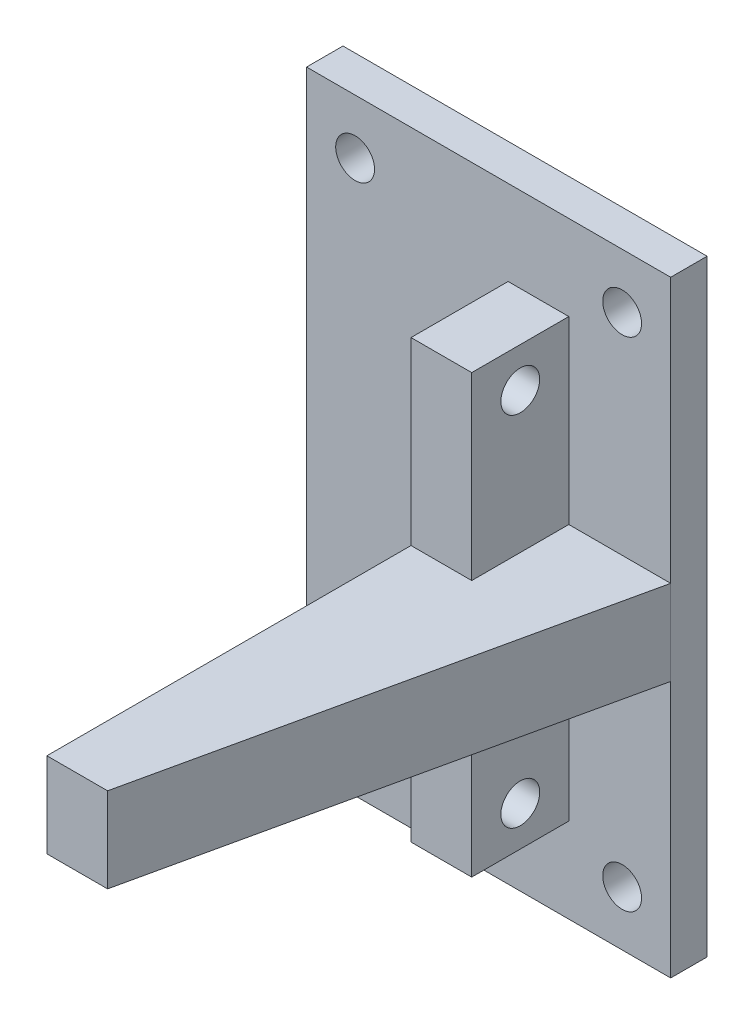
ISO-10303-21;
HEADER;
FILE_DESCRIPTION(('STEP AP214'),'2;1');
FILE_NAME('part.step','',(''),(''),'','','');
FILE_SCHEMA(('AUTOMOTIVE_DESIGN { 1 0 10303 214 1 1 1 1 }'));
ENDSEC;
DATA;
#1=APPLICATION_CONTEXT('core data for automotive mechanical design processes');
#2=APPLICATION_PROTOCOL_DEFINITION('international standard','automotive_design',2000,#1);
#3=PRODUCT_CONTEXT('',#1,'mechanical');
#4=PRODUCT('Part','Part','',(#3));
#5=PRODUCT_RELATED_PRODUCT_CATEGORY('part','',(#4));
#6=PRODUCT_DEFINITION_FORMATION('','',#4);
#7=PRODUCT_DEFINITION_CONTEXT('part definition',#1,'design');
#8=PRODUCT_DEFINITION('design','',#6,#7);
#9=PRODUCT_DEFINITION_SHAPE('','',#8);
#10=(LENGTH_UNIT() NAMED_UNIT(*) SI_UNIT(.MILLI.,.METRE.));
#11=(NAMED_UNIT(*) PLANE_ANGLE_UNIT() SI_UNIT($,.RADIAN.));
#12=(NAMED_UNIT(*) SI_UNIT($,.STERADIAN.) SOLID_ANGLE_UNIT());
#13=UNCERTAINTY_MEASURE_WITH_UNIT(LENGTH_MEASURE(1.E-05),#10,'distance_accuracy_value','');
#14=(GEOMETRIC_REPRESENTATION_CONTEXT(3) GLOBAL_UNCERTAINTY_ASSIGNED_CONTEXT((#13)) GLOBAL_UNIT_ASSIGNED_CONTEXT((#10,
#11,#12)) REPRESENTATION_CONTEXT('',''));
#15=CARTESIAN_POINT('',(0.,0.,0.));
#16=DIRECTION('',(0.,0.,1.));
#17=DIRECTION('',(1.,0.,0.));
#18=AXIS2_PLACEMENT_3D('',#15,#16,#17);
#19=CARTESIAN_POINT('',(-18.3942195591141,3.00000000000001,11.));
#20=DIRECTION('',(-1.,0.,0.));
#21=DIRECTION('',(0.,-1.,0.));
#22=AXIS2_PLACEMENT_3D('',#19,#20,#21);
#23=PLANE('',#22);
#24=CARTESIAN_POINT('',(-18.3942195591141,-29.732,6.99999999999999));
#25=DIRECTION('',(1.,0.,0.));
#26=DIRECTION('',(0.,1.,0.));
#27=AXIS2_PLACEMENT_3D('',#24,#25,#26);
#28=CIRCLE('',#27,1.6);
#29=CARTESIAN_POINT('',(-18.3942195591141,-28.132,6.99999999999999));
#30=VERTEX_POINT('',#29);
#31=EDGE_CURVE('E176',#30,#30,#28,.T.);
#32=ORIENTED_EDGE('',*,*,#31,.F.);
#33=EDGE_LOOP('',(#32));
#34=FACE_BOUND('',#33,.T.);
#35=DIRECTION('',(0.,0.,-1.));
#36=VECTOR('',#35,1.);
#37=CARTESIAN_POINT('',(-18.3942195591141,-18.8399802623942,11.));
#38=LINE('',#37,#36);
#39=CARTESIAN_POINT('',(-18.3942195591141,-18.8399802623942,11.));
#40=VERTEX_POINT('',#39);
#41=CARTESIAN_POINT('',(-18.3942195591141,-18.8399802623942,3.));
#42=VERTEX_POINT('',#41);
#43=EDGE_CURVE('E343',#40,#42,#38,.T.);
#44=ORIENTED_EDGE('',*,*,#43,.F.);
#45=DIRECTION('',(0.,1.,0.));
#46=VECTOR('',#45,1.);
#47=CARTESIAN_POINT('',(-18.3942195591141,3.00000000000001,11.));
#48=LINE('',#47,#46);
#49=CARTESIAN_POINT('',(-18.3942195591141,-33.,11.));
#50=VERTEX_POINT('',#49);
#51=EDGE_CURVE('E194',#50,#40,#48,.T.);
#52=ORIENTED_EDGE('',*,*,#51,.F.);
#53=DIRECTION('',(0.,0.,-1.));
#54=VECTOR('',#53,1.);
#55=CARTESIAN_POINT('',(-18.3942195591141,-33.,11.));
#56=LINE('',#55,#54);
#57=CARTESIAN_POINT('',(-18.3942195591141,-33.,3.));
#58=VERTEX_POINT('',#57);
#59=EDGE_CURVE('E215',#50,#58,#56,.T.);
#60=ORIENTED_EDGE('',*,*,#59,.T.);
#61=DIRECTION('',(0.,1.,0.));
#62=VECTOR('',#61,1.);
#63=CARTESIAN_POINT('',(-18.3942195591141,3.00000000000001,3.));
#64=LINE('',#63,#62);
#65=EDGE_CURVE('E204',#58,#42,#64,.T.);
#66=ORIENTED_EDGE('',*,*,#65,.T.);
#67=EDGE_LOOP('',(#44,#52,#60,#66));
#68=FACE_BOUND('',#67,.T.);
#69=ADVANCED_FACE('F35',(#34,#68),#23,.F.);
#70=CARTESIAN_POINT('',(0.,0.,11.));
#71=DIRECTION('',(0.,0.,-1.));
#72=DIRECTION('',(-1.,0.,0.));
#73=AXIS2_PLACEMENT_3D('',#70,#71,#72);
#74=PLANE('',#73);
#75=DIRECTION('',(-1.,0.,0.));
#76=VECTOR('',#75,1.);
#77=CARTESIAN_POINT('',(-18.3942195591141,-11.8399802623942,11.));
#78=LINE('',#77,#76);
#79=CARTESIAN_POINT('',(-18.3942195591141,-11.8399802623942,11.));
#80=VERTEX_POINT('',#79);
#81=CARTESIAN_POINT('',(-23.3942195591141,-11.8399802623942,11.));
#82=VERTEX_POINT('',#81);
#83=EDGE_CURVE('E163',#80,#82,#78,.T.);
#84=ORIENTED_EDGE('',*,*,#83,.F.);
#85=CARTESIAN_POINT('',(-18.3942195591141,3.00000000000001,11.));
#86=VERTEX_POINT('',#85);
#87=EDGE_CURVE('E193',#80,#86,#48,.T.);
#88=ORIENTED_EDGE('',*,*,#87,.T.);
#89=DIRECTION('',(-1.,0.,0.));
#90=VECTOR('',#89,1.);
#91=CARTESIAN_POINT('',(-18.3942195591141,3.00000000000001,11.));
#92=LINE('',#91,#90);
#93=CARTESIAN_POINT('',(-23.3942195591141,3.00000000000001,11.));
#94=VERTEX_POINT('',#93);
#95=EDGE_CURVE('E196',#86,#94,#92,.T.);
#96=ORIENTED_EDGE('',*,*,#95,.T.);
#97=DIRECTION('',(0.,-1.,0.));
#98=VECTOR('',#97,1.);
#99=CARTESIAN_POINT('',(-23.3942195591141,3.00000000000001,11.));
#100=LINE('',#99,#98);
#101=EDGE_CURVE('E58',#94,#82,#100,.T.);
#102=ORIENTED_EDGE('',*,*,#101,.T.);
#103=EDGE_LOOP('',(#84,#88,#96,#102));
#104=FACE_BOUND('',#103,.T.);
#105=ADVANCED_FACE('F303',(#104),#74,.F.);
#106=DIRECTION('',(1.,0.,0.));
#107=VECTOR('',#106,1.);
#108=CARTESIAN_POINT('',(-18.3942195591141,-18.8399802623942,11.));
#109=LINE('',#108,#107);
#110=CARTESIAN_POINT('',(-23.3942195591141,-18.8399802623942,11.));
#111=VERTEX_POINT('',#110);
#112=EDGE_CURVE('E50',#111,#40,#109,.T.);
#113=ORIENTED_EDGE('',*,*,#112,.F.);
#114=CARTESIAN_POINT('',(-23.3942195591141,-33.,11.));
#115=VERTEX_POINT('',#114);
#116=EDGE_CURVE('E191',#111,#115,#100,.T.);
#117=ORIENTED_EDGE('',*,*,#116,.T.);
#118=DIRECTION('',(1.,0.,0.));
#119=VECTOR('',#118,1.);
#120=CARTESIAN_POINT('',(-18.3942195591141,-33.,11.));
#121=LINE('',#120,#119);
#122=EDGE_CURVE('E190',#115,#50,#121,.T.);
#123=ORIENTED_EDGE('',*,*,#122,.T.);
#124=ORIENTED_EDGE('',*,*,#51,.T.);
#125=EDGE_LOOP('',(#113,#117,#123,#124));
#126=FACE_BOUND('',#125,.T.);
#127=ADVANCED_FACE('F310',(#126),#74,.F.);
#128=CARTESIAN_POINT('',(0.,0.,3.));
#129=DIRECTION('',(0.,0.,-1.));
#130=DIRECTION('',(-1.,0.,0.));
#131=AXIS2_PLACEMENT_3D('',#128,#129,#130);
#132=PLANE('',#131);
#133=CARTESIAN_POINT('',(-36.,5.5,3.));
#134=DIRECTION('',(0.,0.,1.));
#135=DIRECTION('',(1.,0.,0.));
#136=AXIS2_PLACEMENT_3D('',#133,#134,#135);
#137=CIRCLE('',#136,1.60000000000002);
#138=CARTESIAN_POINT('',(-34.4,5.5,3.));
#139=VERTEX_POINT('',#138);
#140=EDGE_CURVE('E222',#139,#139,#137,.T.);
#141=ORIENTED_EDGE('',*,*,#140,.F.);
#142=EDGE_LOOP('',(#141));
#143=FACE_BOUND('',#142,.T.);
#144=CARTESIAN_POINT('',(-14.,5.5,3.));
#145=DIRECTION('',(0.,0.,1.));
#146=DIRECTION('',(1.,0.,0.));
#147=AXIS2_PLACEMENT_3D('',#144,#145,#146);
#148=CIRCLE('',#147,1.60000000000001);
#149=CARTESIAN_POINT('',(-12.4,5.5,3.));
#150=VERTEX_POINT('',#149);
#151=EDGE_CURVE('E240',#150,#150,#148,.T.);
#152=ORIENTED_EDGE('',*,*,#151,.F.);
#153=EDGE_LOOP('',(#152));
#154=FACE_BOUND('',#153,.T.);
#155=DIRECTION('',(0.,-1.,0.));
#156=VECTOR('',#155,1.);
#157=CARTESIAN_POINT('',(-40.,10.,3.));
#158=LINE('',#157,#156);
#159=CARTESIAN_POINT('',(-40.,10.,3.));
#160=VERTEX_POINT('',#159);
#161=CARTESIAN_POINT('',(-40.,-40.,3.));
#162=VERTEX_POINT('',#161);
#163=EDGE_CURVE('E252',#160,#162,#158,.T.);
#164=ORIENTED_EDGE('',*,*,#163,.T.);
#165=DIRECTION('',(1.,0.,0.));
#166=VECTOR('',#165,1.);
#167=CARTESIAN_POINT('',(-10.,-40.,3.));
#168=LINE('',#167,#166);
#169=CARTESIAN_POINT('',(-10.,-40.,3.));
#170=VERTEX_POINT('',#169);
#171=EDGE_CURVE('E254',#162,#170,#168,.T.);
#172=ORIENTED_EDGE('',*,*,#171,.T.);
#173=DIRECTION('',(0.,1.,0.));
#174=VECTOR('',#173,1.);
#175=CARTESIAN_POINT('',(-10.,10.,3.));
#176=LINE('',#175,#174);
#177=CARTESIAN_POINT('',(-9.99999999999999,-18.8399802623942,3.));
#178=VERTEX_POINT('',#177);
#179=EDGE_CURVE('E246',#170,#178,#176,.T.);
#180=ORIENTED_EDGE('',*,*,#179,.T.);
#181=DIRECTION('',(1.,0.,0.));
#182=VECTOR('',#181,1.);
#183=CARTESIAN_POINT('',(0.,-18.8399802623942,3.));
#184=LINE('',#183,#182);
#185=EDGE_CURVE('E156',#42,#178,#184,.T.);
#186=ORIENTED_EDGE('',*,*,#185,.F.);
#187=ORIENTED_EDGE('',*,*,#65,.F.);
#188=DIRECTION('',(1.,0.,0.));
#189=VECTOR('',#188,1.);
#190=CARTESIAN_POINT('',(-18.3942195591141,-33.,3.));
#191=LINE('',#190,#189);
#192=CARTESIAN_POINT('',(-23.3942195591141,-33.,3.));
#193=VERTEX_POINT('',#192);
#194=EDGE_CURVE('E200',#193,#58,#191,.T.);
#195=ORIENTED_EDGE('',*,*,#194,.F.);
#196=DIRECTION('',(0.,-1.,0.));
#197=VECTOR('',#196,1.);
#198=CARTESIAN_POINT('',(-23.3942195591141,3.00000000000001,3.));
#199=LINE('',#198,#197);
#200=CARTESIAN_POINT('',(-23.3942195591141,3.00000000000001,3.));
#201=VERTEX_POINT('',#200);
#202=EDGE_CURVE('E188',#201,#193,#199,.T.);
#203=ORIENTED_EDGE('',*,*,#202,.F.);
#204=DIRECTION('',(-1.,0.,0.));
#205=VECTOR('',#204,1.);
#206=CARTESIAN_POINT('',(-18.3942195591141,3.00000000000001,3.));
#207=LINE('',#206,#205);
#208=CARTESIAN_POINT('',(-18.3942195591141,3.00000000000001,3.));
#209=VERTEX_POINT('',#208);
#210=EDGE_CURVE('E207',#209,#201,#207,.T.);
#211=ORIENTED_EDGE('',*,*,#210,.F.);
#212=CARTESIAN_POINT('',(-18.3942195591141,-11.8399802623942,3.));
#213=VERTEX_POINT('',#212);
#214=EDGE_CURVE('E203',#213,#209,#64,.T.);
#215=ORIENTED_EDGE('',*,*,#214,.F.);
#216=DIRECTION('',(1.,0.,0.));
#217=VECTOR('',#216,1.);
#218=CARTESIAN_POINT('',(0.,-11.8399802623942,3.));
#219=LINE('',#218,#217);
#220=CARTESIAN_POINT('',(-10.,-11.8399802623942,3.));
#221=VERTEX_POINT('',#220);
#222=EDGE_CURVE('E346',#213,#221,#219,.T.);
#223=ORIENTED_EDGE('',*,*,#222,.T.);
#224=CARTESIAN_POINT('',(-10.,10.,3.));
#225=VERTEX_POINT('',#224);
#226=EDGE_CURVE('E250',#221,#225,#176,.T.);
#227=ORIENTED_EDGE('',*,*,#226,.T.);
#228=DIRECTION('',(-1.,0.,0.));
#229=VECTOR('',#228,1.);
#230=CARTESIAN_POINT('',(-10.,10.,3.));
#231=LINE('',#230,#229);
#232=EDGE_CURVE('E249',#225,#160,#231,.T.);
#233=ORIENTED_EDGE('',*,*,#232,.T.);
#234=EDGE_LOOP('',(#164,#172,#180,#186,#187,#195,#203,#211,#215,#223,#227,#233));
#235=FACE_BOUND('',#234,.T.);
#236=CARTESIAN_POINT('',(-36.,-35.5,3.));
#237=DIRECTION('',(0.,0.,1.));
#238=DIRECTION('',(1.,0.,0.));
#239=AXIS2_PLACEMENT_3D('',#236,#237,#238);
#240=CIRCLE('',#239,1.60000000000002);
#241=CARTESIAN_POINT('',(-34.4,-35.5,3.));
#242=VERTEX_POINT('',#241);
#243=EDGE_CURVE('E234',#242,#242,#240,.T.);
#244=ORIENTED_EDGE('',*,*,#243,.F.);
#245=EDGE_LOOP('',(#244));
#246=FACE_BOUND('',#245,.T.);
#247=CARTESIAN_POINT('',(-14.,-35.5,3.));
#248=DIRECTION('',(0.,0.,1.));
#249=DIRECTION('',(1.,0.,0.));
#250=AXIS2_PLACEMENT_3D('',#247,#248,#249);
#251=CIRCLE('',#250,1.60000000000001);
#252=CARTESIAN_POINT('',(-12.4,-35.5,3.));
#253=VERTEX_POINT('',#252);
#254=EDGE_CURVE('E228',#253,#253,#251,.T.);
#255=ORIENTED_EDGE('',*,*,#254,.F.);
#256=EDGE_LOOP('',(#255));
#257=FACE_BOUND('',#256,.T.);
#258=ADVANCED_FACE('F292',(#143,#154,#235,#246,#257),#132,.F.);
#259=CARTESIAN_POINT('',(0.,0.,0.));
#260=DIRECTION('',(0.,0.,-1.));
#261=DIRECTION('',(-1.,0.,0.));
#262=AXIS2_PLACEMENT_3D('',#259,#260,#261);
#263=PLANE('',#262);
#264=DIRECTION('',(-1.,0.,0.));
#265=VECTOR('',#264,1.);
#266=CARTESIAN_POINT('',(-10.,10.,0.));
#267=LINE('',#266,#265);
#268=CARTESIAN_POINT('',(-10.,10.,0.));
#269=VERTEX_POINT('',#268);
#270=CARTESIAN_POINT('',(-40.,10.,0.));
#271=VERTEX_POINT('',#270);
#272=EDGE_CURVE('E258',#269,#271,#267,.T.);
#273=ORIENTED_EDGE('',*,*,#272,.F.);
#274=DIRECTION('',(0.,1.,0.));
#275=VECTOR('',#274,1.);
#276=CARTESIAN_POINT('',(-10.,10.,0.));
#277=LINE('',#276,#275);
#278=CARTESIAN_POINT('',(-10.,-40.,0.));
#279=VERTEX_POINT('',#278);
#280=EDGE_CURVE('E243',#279,#269,#277,.T.);
#281=ORIENTED_EDGE('',*,*,#280,.F.);
#282=DIRECTION('',(1.,0.,0.));
#283=VECTOR('',#282,1.);
#284=CARTESIAN_POINT('',(-10.,-40.,0.));
#285=LINE('',#284,#283);
#286=CARTESIAN_POINT('',(-40.,-40.,0.));
#287=VERTEX_POINT('',#286);
#288=EDGE_CURVE('E262',#287,#279,#285,.T.);
#289=ORIENTED_EDGE('',*,*,#288,.F.);
#290=DIRECTION('',(0.,-1.,0.));
#291=VECTOR('',#290,1.);
#292=CARTESIAN_POINT('',(-40.,10.,0.));
#293=LINE('',#292,#291);
#294=EDGE_CURVE('E260',#271,#287,#293,.T.);
#295=ORIENTED_EDGE('',*,*,#294,.F.);
#296=EDGE_LOOP('',(#273,#281,#289,#295));
#297=FACE_BOUND('',#296,.T.);
#298=CARTESIAN_POINT('',(-14.,5.5,0.));
#299=DIRECTION('',(0.,0.,1.));
#300=DIRECTION('',(1.,0.,0.));
#301=AXIS2_PLACEMENT_3D('',#298,#299,#300);
#302=CIRCLE('',#301,1.60000000000001);
#303=CARTESIAN_POINT('',(-12.4,5.5,0.));
#304=VERTEX_POINT('',#303);
#305=EDGE_CURVE('E237',#304,#304,#302,.T.);
#306=ORIENTED_EDGE('',*,*,#305,.T.);
#307=EDGE_LOOP('',(#306));
#308=FACE_BOUND('',#307,.T.);
#309=CARTESIAN_POINT('',(-36.,5.5,0.));
#310=DIRECTION('',(0.,0.,1.));
#311=DIRECTION('',(1.,0.,0.));
#312=AXIS2_PLACEMENT_3D('',#309,#310,#311);
#313=CIRCLE('',#312,1.60000000000002);
#314=CARTESIAN_POINT('',(-34.4,5.5,0.));
#315=VERTEX_POINT('',#314);
#316=EDGE_CURVE('E221',#315,#315,#313,.T.);
#317=ORIENTED_EDGE('',*,*,#316,.T.);
#318=EDGE_LOOP('',(#317));
#319=FACE_BOUND('',#318,.T.);
#320=CARTESIAN_POINT('',(-36.,-35.5,0.));
#321=DIRECTION('',(0.,0.,1.));
#322=DIRECTION('',(1.,0.,0.));
#323=AXIS2_PLACEMENT_3D('',#320,#321,#322);
#324=CIRCLE('',#323,1.60000000000002);
#325=CARTESIAN_POINT('',(-34.4,-35.5,0.));
#326=VERTEX_POINT('',#325);
#327=EDGE_CURVE('E231',#326,#326,#324,.T.);
#328=ORIENTED_EDGE('',*,*,#327,.T.);
#329=EDGE_LOOP('',(#328));
#330=FACE_BOUND('',#329,.T.);
#331=CARTESIAN_POINT('',(-14.,-35.5,0.));
#332=DIRECTION('',(0.,0.,1.));
#333=DIRECTION('',(1.,0.,0.));
#334=AXIS2_PLACEMENT_3D('',#331,#332,#333);
#335=CIRCLE('',#334,1.60000000000001);
#336=CARTESIAN_POINT('',(-12.4,-35.5,0.));
#337=VERTEX_POINT('',#336);
#338=EDGE_CURVE('E225',#337,#337,#335,.T.);
#339=ORIENTED_EDGE('',*,*,#338,.T.);
#340=EDGE_LOOP('',(#339));
#341=FACE_BOUND('',#340,.T.);
#342=ADVANCED_FACE('F280',(#297,#308,#319,#330,#341),#263,.T.);
#343=CARTESIAN_POINT('',(-10.,10.,3.));
#344=DIRECTION('',(-1.,0.,0.));
#345=DIRECTION('',(0.,0.,1.));
#346=AXIS2_PLACEMENT_3D('',#343,#344,#345);
#347=PLANE('',#346);
#348=ORIENTED_EDGE('',*,*,#226,.F.);
#349=DIRECTION('',(0.,1.,0.));
#350=VECTOR('',#349,1.);
#351=CARTESIAN_POINT('',(-10.,10.,3.));
#352=LINE('',#351,#350);
#353=EDGE_CURVE('E170',#178,#221,#352,.T.);
#354=ORIENTED_EDGE('',*,*,#353,.F.);
#355=ORIENTED_EDGE('',*,*,#179,.F.);
#356=DIRECTION('',(0.,0.,-1.));
#357=VECTOR('',#356,1.);
#358=CARTESIAN_POINT('',(-10.,-40.,3.));
#359=LINE('',#358,#357);
#360=EDGE_CURVE('E256',#170,#279,#359,.T.);
#361=ORIENTED_EDGE('',*,*,#360,.T.);
#362=ORIENTED_EDGE('',*,*,#280,.T.);
#363=DIRECTION('',(0.,0.,-1.));
#364=VECTOR('',#363,1.);
#365=CARTESIAN_POINT('',(-10.,10.,3.));
#366=LINE('',#365,#364);
#367=EDGE_CURVE('E11',#225,#269,#366,.T.);
#368=ORIENTED_EDGE('',*,*,#367,.F.);
#369=EDGE_LOOP('',(#348,#354,#355,#361,#362,#368));
#370=FACE_BOUND('',#369,.T.);
#371=ADVANCED_FACE('F37',(#370),#347,.F.);
#372=CARTESIAN_POINT('',(-10.,10.,3.));
#373=DIRECTION('',(0.,-1.,0.));
#374=DIRECTION('',(0.,0.,-1.));
#375=AXIS2_PLACEMENT_3D('',#372,#373,#374);
#376=PLANE('',#375);
#377=ORIENTED_EDGE('',*,*,#272,.T.);
#378=DIRECTION('',(0.,0.,-1.));
#379=VECTOR('',#378,1.);
#380=CARTESIAN_POINT('',(-40.,10.,3.));
#381=LINE('',#380,#379);
#382=EDGE_CURVE('E43',#160,#271,#381,.T.);
#383=ORIENTED_EDGE('',*,*,#382,.F.);
#384=ORIENTED_EDGE('',*,*,#232,.F.);
#385=ORIENTED_EDGE('',*,*,#367,.T.);
#386=EDGE_LOOP('',(#377,#383,#384,#385));
#387=FACE_BOUND('',#386,.T.);
#388=ADVANCED_FACE('F295',(#387),#376,.F.);
#389=CARTESIAN_POINT('',(-40.,10.,3.));
#390=DIRECTION('',(1.,0.,0.));
#391=DIRECTION('',(0.,0.,-1.));
#392=AXIS2_PLACEMENT_3D('',#389,#390,#391);
#393=PLANE('',#392);
#394=ORIENTED_EDGE('',*,*,#294,.T.);
#395=DIRECTION('',(0.,0.,-1.));
#396=VECTOR('',#395,1.);
#397=CARTESIAN_POINT('',(-40.,-40.,3.));
#398=LINE('',#397,#396);
#399=EDGE_CURVE('E266',#162,#287,#398,.T.);
#400=ORIENTED_EDGE('',*,*,#399,.F.);
#401=ORIENTED_EDGE('',*,*,#163,.F.);
#402=ORIENTED_EDGE('',*,*,#382,.T.);
#403=EDGE_LOOP('',(#394,#400,#401,#402));
#404=FACE_BOUND('',#403,.T.);
#405=ADVANCED_FACE('F273',(#404),#393,.F.);
#406=CARTESIAN_POINT('',(-10.,-40.,3.));
#407=DIRECTION('',(0.,1.,0.));
#408=DIRECTION('',(0.,0.,1.));
#409=AXIS2_PLACEMENT_3D('',#406,#407,#408);
#410=PLANE('',#409);
#411=ORIENTED_EDGE('',*,*,#288,.T.);
#412=ORIENTED_EDGE('',*,*,#360,.F.);
#413=ORIENTED_EDGE('',*,*,#171,.F.);
#414=ORIENTED_EDGE('',*,*,#399,.T.);
#415=EDGE_LOOP('',(#411,#412,#413,#414));
#416=FACE_BOUND('',#415,.T.);
#417=ADVANCED_FACE('F285',(#416),#410,.F.);
#418=CARTESIAN_POINT('',(-14.,5.5,3.));
#419=DIRECTION('',(0.,0.,-1.));
#420=DIRECTION('',(-1.,0.,0.));
#421=AXIS2_PLACEMENT_3D('',#418,#419,#420);
#422=CYLINDRICAL_SURFACE('',#421,1.60000000000001);
#423=ORIENTED_EDGE('',*,*,#151,.T.);
#424=EDGE_LOOP('',(#423));
#425=FACE_BOUND('',#424,.T.);
#426=ORIENTED_EDGE('',*,*,#305,.F.);
#427=EDGE_LOOP('',(#426));
#428=FACE_BOUND('',#427,.T.);
#429=ADVANCED_FACE('F442',(#425,#428),#422,.F.);
#430=CARTESIAN_POINT('',(-36.,-35.5,3.));
#431=DIRECTION('',(0.,0.,-1.));
#432=DIRECTION('',(-1.,0.,0.));
#433=AXIS2_PLACEMENT_3D('',#430,#431,#432);
#434=CYLINDRICAL_SURFACE('',#433,1.60000000000002);
#435=ORIENTED_EDGE('',*,*,#243,.T.);
#436=EDGE_LOOP('',(#435));
#437=FACE_BOUND('',#436,.T.);
#438=ORIENTED_EDGE('',*,*,#327,.F.);
#439=EDGE_LOOP('',(#438));
#440=FACE_BOUND('',#439,.T.);
#441=ADVANCED_FACE('F432',(#437,#440),#434,.F.);
#442=CARTESIAN_POINT('',(-14.,-35.5,3.));
#443=DIRECTION('',(0.,0.,-1.));
#444=DIRECTION('',(-1.,0.,0.));
#445=AXIS2_PLACEMENT_3D('',#442,#443,#444);
#446=CYLINDRICAL_SURFACE('',#445,1.60000000000001);
#447=ORIENTED_EDGE('',*,*,#254,.T.);
#448=EDGE_LOOP('',(#447));
#449=FACE_BOUND('',#448,.T.);
#450=ORIENTED_EDGE('',*,*,#338,.F.);
#451=EDGE_LOOP('',(#450));
#452=FACE_BOUND('',#451,.T.);
#453=ADVANCED_FACE('F421',(#449,#452),#446,.F.);
#454=CARTESIAN_POINT('',(-36.,5.5,3.));
#455=DIRECTION('',(0.,0.,-1.));
#456=DIRECTION('',(-1.,0.,0.));
#457=AXIS2_PLACEMENT_3D('',#454,#455,#456);
#458=CYLINDRICAL_SURFACE('',#457,1.60000000000002);
#459=ORIENTED_EDGE('',*,*,#140,.T.);
#460=EDGE_LOOP('',(#459));
#461=FACE_BOUND('',#460,.T.);
#462=ORIENTED_EDGE('',*,*,#316,.F.);
#463=EDGE_LOOP('',(#462));
#464=FACE_BOUND('',#463,.T.);
#465=ADVANCED_FACE('F416',(#461,#464),#458,.F.);
#466=CARTESIAN_POINT('',(-23.3942195591141,3.00000000000001,11.));
#467=DIRECTION('',(1.,0.,0.));
#468=DIRECTION('',(0.,1.,0.));
#469=AXIS2_PLACEMENT_3D('',#466,#467,#468);
#470=PLANE('',#469);
#471=CARTESIAN_POINT('',(-23.3942195591141,-0.267999999999993,7.));
#472=DIRECTION('',(1.,0.,0.));
#473=DIRECTION('',(0.,1.,0.));
#474=AXIS2_PLACEMENT_3D('',#471,#472,#473);
#475=CIRCLE('',#474,1.6);
#476=CARTESIAN_POINT('',(-23.3942195591141,1.33200000000001,7.));
#477=VERTEX_POINT('',#476);
#478=EDGE_CURVE('E185',#477,#477,#475,.T.);
#479=ORIENTED_EDGE('',*,*,#478,.T.);
#480=EDGE_LOOP('',(#479));
#481=FACE_BOUND('',#480,.T.);
#482=ORIENTED_EDGE('',*,*,#202,.T.);
#483=DIRECTION('',(0.,0.,-1.));
#484=VECTOR('',#483,1.);
#485=CARTESIAN_POINT('',(-23.3942195591141,-33.,11.));
#486=LINE('',#485,#484);
#487=EDGE_CURVE('E218',#115,#193,#486,.T.);
#488=ORIENTED_EDGE('',*,*,#487,.F.);
#489=ORIENTED_EDGE('',*,*,#116,.F.);
#490=DIRECTION('',(0.,0.,-1.));
#491=VECTOR('',#490,1.);
#492=CARTESIAN_POINT('',(-23.3942195591141,-18.8399802623942,41.));
#493=LINE('',#492,#491);
#494=CARTESIAN_POINT('',(-23.3942195591141,-18.8399802623942,41.));
#495=VERTEX_POINT('',#494);
#496=EDGE_CURVE('E174',#495,#111,#493,.T.);
#497=ORIENTED_EDGE('',*,*,#496,.F.);
#498=DIRECTION('',(0.,-1.,0.));
#499=VECTOR('',#498,1.);
#500=CARTESIAN_POINT('',(-23.3942195591141,-11.8399802623942,41.));
#501=LINE('',#500,#499);
#502=CARTESIAN_POINT('',(-23.3942195591141,-11.8399802623942,41.));
#503=VERTEX_POINT('',#502);
#504=EDGE_CURVE('E160',#503,#495,#501,.T.);
#505=ORIENTED_EDGE('',*,*,#504,.F.);
#506=DIRECTION('',(0.,0.,-1.));
#507=VECTOR('',#506,1.);
#508=CARTESIAN_POINT('',(-23.3942195591141,-11.8399802623942,41.));
#509=LINE('',#508,#507);
#510=EDGE_CURVE('E168',#503,#82,#509,.T.);
#511=ORIENTED_EDGE('',*,*,#510,.T.);
#512=ORIENTED_EDGE('',*,*,#101,.F.);
#513=DIRECTION('',(0.,0.,-1.));
#514=VECTOR('',#513,1.);
#515=CARTESIAN_POINT('',(-23.3942195591141,3.00000000000001,11.));
#516=LINE('',#515,#514);
#517=EDGE_CURVE('E198',#94,#201,#516,.T.);
#518=ORIENTED_EDGE('',*,*,#517,.T.);
#519=EDGE_LOOP('',(#482,#488,#489,#497,#505,#511,#512,#518));
#520=FACE_BOUND('',#519,.T.);
#521=CARTESIAN_POINT('',(-23.3942195591141,-29.732,6.99999999999999));
#522=DIRECTION('',(1.,0.,0.));
#523=DIRECTION('',(0.,1.,0.));
#524=AXIS2_PLACEMENT_3D('',#521,#522,#523);
#525=CIRCLE('',#524,1.6);
#526=CARTESIAN_POINT('',(-23.3942195591141,-28.132,6.99999999999999));
#527=VERTEX_POINT('',#526);
#528=EDGE_CURVE('E180',#527,#527,#525,.T.);
#529=ORIENTED_EDGE('',*,*,#528,.T.);
#530=EDGE_LOOP('',(#529));
#531=FACE_BOUND('',#530,.T.);
#532=ADVANCED_FACE('F326',(#481,#520,#531),#470,.F.);
#533=CARTESIAN_POINT('',(-18.3942195591141,-33.,11.));
#534=DIRECTION('',(0.,1.,0.));
#535=DIRECTION('',(0.,0.,1.));
#536=AXIS2_PLACEMENT_3D('',#533,#534,#535);
#537=PLANE('',#536);
#538=ORIENTED_EDGE('',*,*,#194,.T.);
#539=ORIENTED_EDGE('',*,*,#59,.F.);
#540=ORIENTED_EDGE('',*,*,#122,.F.);
#541=ORIENTED_EDGE('',*,*,#487,.T.);
#542=EDGE_LOOP('',(#538,#539,#540,#541));
#543=FACE_BOUND('',#542,.T.);
#544=ADVANCED_FACE('F318',(#543),#537,.F.);
#545=CARTESIAN_POINT('',(-18.3942195591141,-0.267999999999992,7.));
#546=DIRECTION('',(1.,0.,0.));
#547=DIRECTION('',(0.,1.,0.));
#548=AXIS2_PLACEMENT_3D('',#545,#546,#547);
#549=CIRCLE('',#548,1.6);
#550=CARTESIAN_POINT('',(-18.3942195591141,1.33200000000001,7.));
#551=VERTEX_POINT('',#550);
#552=EDGE_CURVE('E177',#551,#551,#549,.T.);
#553=ORIENTED_EDGE('',*,*,#552,.F.);
#554=EDGE_LOOP('',(#553));
#555=FACE_BOUND('',#554,.T.);
#556=ORIENTED_EDGE('',*,*,#87,.F.);
#557=DIRECTION('',(0.,0.,-1.));
#558=VECTOR('',#557,1.);
#559=CARTESIAN_POINT('',(-18.3942195591141,-11.8399802623942,11.));
#560=LINE('',#559,#558);
#561=EDGE_CURVE('E333',#80,#213,#560,.T.);
#562=ORIENTED_EDGE('',*,*,#561,.T.);
#563=ORIENTED_EDGE('',*,*,#214,.T.);
#564=DIRECTION('',(0.,0.,-1.));
#565=VECTOR('',#564,1.);
#566=CARTESIAN_POINT('',(-18.3942195591141,3.00000000000001,11.));
#567=LINE('',#566,#565);
#568=EDGE_CURVE('E212',#86,#209,#567,.T.);
#569=ORIENTED_EDGE('',*,*,#568,.F.);
#570=EDGE_LOOP('',(#556,#562,#563,#569));
#571=FACE_BOUND('',#570,.T.);
#572=ADVANCED_FACE('F306',(#555,#571),#23,.F.);
#573=CARTESIAN_POINT('',(-18.3942195591141,3.00000000000001,11.));
#574=DIRECTION('',(0.,-1.,0.));
#575=DIRECTION('',(1.,0.,0.));
#576=AXIS2_PLACEMENT_3D('',#573,#574,#575);
#577=PLANE('',#576);
#578=ORIENTED_EDGE('',*,*,#210,.T.);
#579=ORIENTED_EDGE('',*,*,#517,.F.);
#580=ORIENTED_EDGE('',*,*,#95,.F.);
#581=ORIENTED_EDGE('',*,*,#568,.T.);
#582=EDGE_LOOP('',(#578,#579,#580,#581));
#583=FACE_BOUND('',#582,.T.);
#584=ADVANCED_FACE('F317',(#583),#577,.F.);
#585=CARTESIAN_POINT('',(-28.3942195591141,-29.732,6.99999999999999));
#586=DIRECTION('',(1.,0.,0.));
#587=DIRECTION('',(0.,1.,0.));
#588=AXIS2_PLACEMENT_3D('',#585,#586,#587);
#589=CYLINDRICAL_SURFACE('',#588,1.6);
#590=ORIENTED_EDGE('',*,*,#31,.T.);
#591=EDGE_LOOP('',(#590));
#592=FACE_BOUND('',#591,.T.);
#593=ORIENTED_EDGE('',*,*,#528,.F.);
#594=EDGE_LOOP('',(#593));
#595=FACE_BOUND('',#594,.T.);
#596=ADVANCED_FACE('F324',(#592,#595),#589,.F.);
#597=CARTESIAN_POINT('',(-28.3942195591141,-0.267999999999993,7.));
#598=DIRECTION('',(1.,0.,0.));
#599=DIRECTION('',(0.,1.,0.));
#600=AXIS2_PLACEMENT_3D('',#597,#598,#599);
#601=CYLINDRICAL_SURFACE('',#600,1.6);
#602=ORIENTED_EDGE('',*,*,#552,.T.);
#603=EDGE_LOOP('',(#602));
#604=FACE_BOUND('',#603,.T.);
#605=ORIENTED_EDGE('',*,*,#478,.F.);
#606=EDGE_LOOP('',(#605));
#607=FACE_BOUND('',#606,.T.);
#608=ADVANCED_FACE('F364',(#604,#607),#601,.F.);
#609=CARTESIAN_POINT('',(-18.3942195591141,-18.8399802623942,41.));
#610=DIRECTION('',(0.,1.,0.));
#611=DIRECTION('',(0.,0.,1.));
#612=AXIS2_PLACEMENT_3D('',#609,#610,#611);
#613=PLANE('',#612);
#614=ORIENTED_EDGE('',*,*,#112,.T.);
#615=ORIENTED_EDGE('',*,*,#43,.T.);
#616=ORIENTED_EDGE('',*,*,#185,.T.);
#617=DIRECTION('',(0.215700425521971,0.,-0.976459587709415));
#618=VECTOR('',#617,1.);
#619=CARTESIAN_POINT('',(-18.3942195591141,-18.8399802623942,41.));
#620=LINE('',#619,#618);
#621=CARTESIAN_POINT('',(-18.3942195591141,-18.8399802623942,41.));
#622=VERTEX_POINT('',#621);
#623=EDGE_CURVE('E141',#622,#178,#620,.T.);
#624=ORIENTED_EDGE('',*,*,#623,.F.);
#625=DIRECTION('',(1.,0.,0.));
#626=VECTOR('',#625,1.);
#627=CARTESIAN_POINT('',(-18.3942195591141,-18.8399802623942,41.));
#628=LINE('',#627,#626);
#629=EDGE_CURVE('E149',#495,#622,#628,.T.);
#630=ORIENTED_EDGE('',*,*,#629,.F.);
#631=ORIENTED_EDGE('',*,*,#496,.T.);
#632=EDGE_LOOP('',(#614,#615,#616,#624,#630,#631));
#633=FACE_BOUND('',#632,.T.);
#634=ADVANCED_FACE('F152',(#633),#613,.F.);
#635=CARTESIAN_POINT('',(-18.3942195591141,-11.8399802623942,41.));
#636=DIRECTION('',(0.,-1.,0.));
#637=DIRECTION('',(1.,0.,0.));
#638=AXIS2_PLACEMENT_3D('',#635,#636,#637);
#639=PLANE('',#638);
#640=ORIENTED_EDGE('',*,*,#83,.T.);
#641=ORIENTED_EDGE('',*,*,#510,.F.);
#642=DIRECTION('',(-1.,0.,0.));
#643=VECTOR('',#642,1.);
#644=CARTESIAN_POINT('',(-18.3942195591141,-11.8399802623942,41.));
#645=LINE('',#644,#643);
#646=CARTESIAN_POINT('',(-18.3942195591141,-11.8399802623942,41.));
#647=VERTEX_POINT('',#646);
#648=EDGE_CURVE('E148',#647,#503,#645,.T.);
#649=ORIENTED_EDGE('',*,*,#648,.F.);
#650=DIRECTION('',(0.215700425521971,0.,-0.976459587709415));
#651=VECTOR('',#650,1.);
#652=CARTESIAN_POINT('',(-18.3942195591141,-11.8399802623942,41.));
#653=LINE('',#652,#651);
#654=EDGE_CURVE('E144',#647,#221,#653,.T.);
#655=ORIENTED_EDGE('',*,*,#654,.T.);
#656=ORIENTED_EDGE('',*,*,#222,.F.);
#657=ORIENTED_EDGE('',*,*,#561,.F.);
#658=EDGE_LOOP('',(#640,#641,#649,#655,#656,#657));
#659=FACE_BOUND('',#658,.T.);
#660=ADVANCED_FACE('F339',(#659),#639,.F.);
#661=CARTESIAN_POINT('',(0.,0.,41.));
#662=DIRECTION('',(0.,0.,-1.));
#663=DIRECTION('',(-1.,0.,0.));
#664=AXIS2_PLACEMENT_3D('',#661,#662,#663);
#665=PLANE('',#664);
#666=ORIENTED_EDGE('',*,*,#504,.T.);
#667=ORIENTED_EDGE('',*,*,#629,.T.);
#668=DIRECTION('',(0.,1.,0.));
#669=VECTOR('',#668,1.);
#670=CARTESIAN_POINT('',(-18.3942195591141,-11.8399802623942,41.));
#671=LINE('',#670,#669);
#672=EDGE_CURVE('E138',#622,#647,#671,.T.);
#673=ORIENTED_EDGE('',*,*,#672,.T.);
#674=ORIENTED_EDGE('',*,*,#648,.T.);
#675=EDGE_LOOP('',(#666,#667,#673,#674));
#676=FACE_BOUND('',#675,.T.);
#677=ADVANCED_FACE('F158',(#676),#665,.F.);
#678=CARTESIAN_POINT('',(-18.3942195591141,-11.8399802623942,41.));
#679=DIRECTION('',(0.976459587709415,0.,0.215700425521971));
#680=DIRECTION('',(0.215700425521971,0.,-0.976459587709415));
#681=AXIS2_PLACEMENT_3D('',#678,#679,#680);
#682=PLANE('',#681);
#683=ORIENTED_EDGE('',*,*,#623,.T.);
#684=ORIENTED_EDGE('',*,*,#353,.T.);
#685=ORIENTED_EDGE('',*,*,#654,.F.);
#686=ORIENTED_EDGE('',*,*,#672,.F.);
#687=EDGE_LOOP('',(#683,#684,#685,#686));
#688=FACE_BOUND('',#687,.T.);
#689=ADVANCED_FACE('F140',(#688),#682,.T.);
#690=CLOSED_SHELL('',(#69,#105,#127,#258,#342,#371,#388,#405,#417,#429,#441,#453,#465,#532,#544,
#572,#584,#596,#608,#634,#660,#677,#689));
#691=MANIFOLD_SOLID_BREP('B2',#690);
#692=ADVANCED_BREP_SHAPE_REPRESENTATION('',(#18,#691),#14);
#693=SHAPE_DEFINITION_REPRESENTATION(#9,#692);
ENDSEC;
END-ISO-10303-21;
